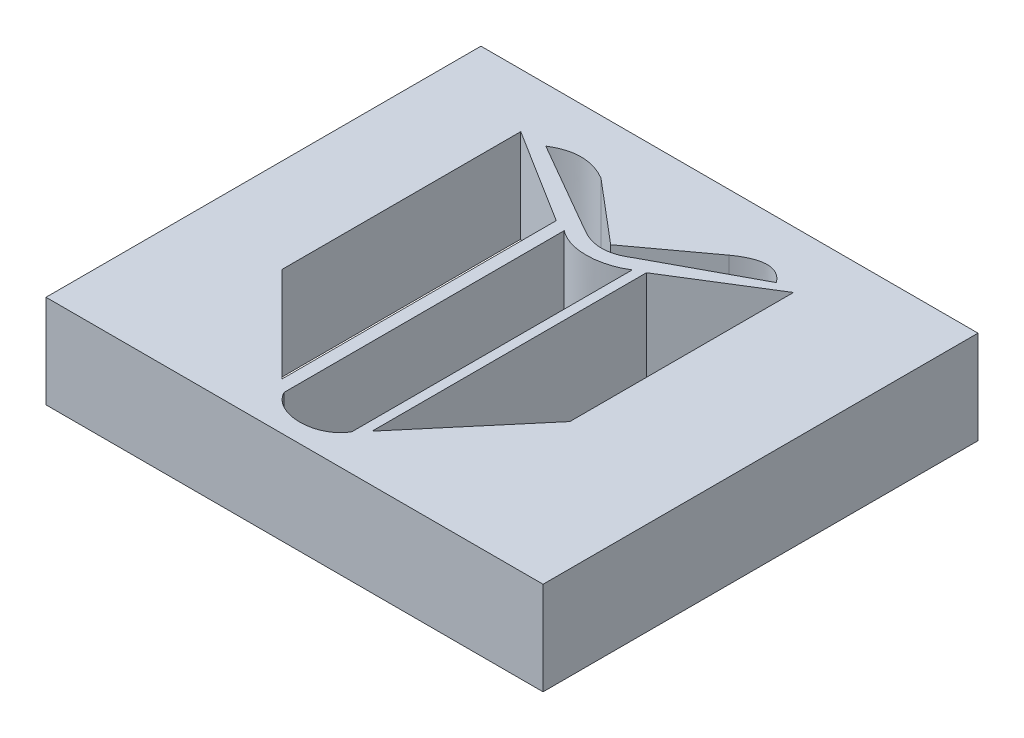
ISO-10303-21;
HEADER;
FILE_DESCRIPTION(('STEP AP214'),'2;1');
FILE_NAME('part.step','',(''),(''),'','','');
FILE_SCHEMA(('AUTOMOTIVE_DESIGN { 1 0 10303 214 1 1 1 1 }'));
ENDSEC;
DATA;
#1=APPLICATION_CONTEXT('core data for automotive mechanical design processes');
#2=APPLICATION_PROTOCOL_DEFINITION('international standard','automotive_design',2000,#1);
#3=PRODUCT_CONTEXT('',#1,'mechanical');
#4=PRODUCT('Part','Part','',(#3));
#5=PRODUCT_RELATED_PRODUCT_CATEGORY('part','',(#4));
#6=PRODUCT_DEFINITION_FORMATION('','',#4);
#7=PRODUCT_DEFINITION_CONTEXT('part definition',#1,'design');
#8=PRODUCT_DEFINITION('design','',#6,#7);
#9=PRODUCT_DEFINITION_SHAPE('','',#8);
#10=(LENGTH_UNIT() NAMED_UNIT(*) SI_UNIT(.MILLI.,.METRE.));
#11=(NAMED_UNIT(*) PLANE_ANGLE_UNIT() SI_UNIT($,.RADIAN.));
#12=(NAMED_UNIT(*) SI_UNIT($,.STERADIAN.) SOLID_ANGLE_UNIT());
#13=UNCERTAINTY_MEASURE_WITH_UNIT(LENGTH_MEASURE(1.E-05),#10,'distance_accuracy_value','');
#14=(GEOMETRIC_REPRESENTATION_CONTEXT(3) GLOBAL_UNCERTAINTY_ASSIGNED_CONTEXT((#13)) GLOBAL_UNIT_ASSIGNED_CONTEXT((#10,
#11,#12)) REPRESENTATION_CONTEXT('',''));
#15=CARTESIAN_POINT('',(0.,0.,0.));
#16=DIRECTION('',(0.,0.,1.));
#17=DIRECTION('',(1.,0.,0.));
#18=AXIS2_PLACEMENT_3D('',#15,#16,#17);
#19=CARTESIAN_POINT('',(-42.8025477707006,3.,-22.3184713375796));
#20=DIRECTION('',(1.,0.,0.));
#21=DIRECTION('',(0.,0.,-1.));
#22=AXIS2_PLACEMENT_3D('',#19,#20,#21);
#23=PLANE('',#22);
#24=DIRECTION('',(0.,0.,1.));
#25=VECTOR('',#24,1.);
#26=CARTESIAN_POINT('',(-42.8025477707006,0.,-22.3184713375796));
#27=LINE('',#26,#25);
#28=CARTESIAN_POINT('',(-42.8025477707006,0.,-22.3184713375796));
#29=VERTEX_POINT('',#28);
#30=CARTESIAN_POINT('',(-42.8025477707006,0.,-8.31847133757962));
#31=VERTEX_POINT('',#30);
#32=EDGE_CURVE('E313',#29,#31,#27,.T.);
#33=ORIENTED_EDGE('',*,*,#32,.T.);
#34=DIRECTION('',(0.,-1.,0.));
#35=VECTOR('',#34,1.);
#36=CARTESIAN_POINT('',(-42.8025477707006,3.,-8.31847133757962));
#37=LINE('',#36,#35);
#38=CARTESIAN_POINT('',(-42.8025477707006,3.,-8.31847133757962));
#39=VERTEX_POINT('',#38);
#40=EDGE_CURVE('E11',#39,#31,#37,.T.);
#41=ORIENTED_EDGE('',*,*,#40,.F.);
#42=DIRECTION('',(0.,0.,1.));
#43=VECTOR('',#42,1.);
#44=CARTESIAN_POINT('',(-42.8025477707006,3.,-22.3184713375796));
#45=LINE('',#44,#43);
#46=CARTESIAN_POINT('',(-42.8025477707006,3.,-22.3184713375796));
#47=VERTEX_POINT('',#46);
#48=EDGE_CURVE('E320',#47,#39,#45,.T.);
#49=ORIENTED_EDGE('',*,*,#48,.F.);
#50=DIRECTION('',(0.,-1.,0.));
#51=VECTOR('',#50,1.);
#52=CARTESIAN_POINT('',(-42.8025477707006,3.,-22.3184713375796));
#53=LINE('',#52,#51);
#54=EDGE_CURVE('E332',#47,#29,#53,.T.);
#55=ORIENTED_EDGE('',*,*,#54,.T.);
#56=EDGE_LOOP('',(#33,#41,#49,#55));
#57=FACE_BOUND('',#56,.T.);
#58=ADVANCED_FACE('F32',(#57),#23,.F.);
#59=CARTESIAN_POINT('',(-42.8025477707006,3.,-8.31847133757962));
#60=DIRECTION('',(0.,0.,-1.));
#61=DIRECTION('',(-1.,0.,0.));
#62=AXIS2_PLACEMENT_3D('',#59,#60,#61);
#63=PLANE('',#62);
#64=DIRECTION('',(1.,0.,0.));
#65=VECTOR('',#64,1.);
#66=CARTESIAN_POINT('',(-42.8025477707006,0.,-8.31847133757962));
#67=LINE('',#66,#65);
#68=CARTESIAN_POINT('',(-26.8025477707006,0.,-8.31847133757962));
#69=VERTEX_POINT('',#68);
#70=EDGE_CURVE('E335',#31,#69,#67,.T.);
#71=ORIENTED_EDGE('',*,*,#70,.T.);
#72=DIRECTION('',(0.,-1.,0.));
#73=VECTOR('',#72,1.);
#74=CARTESIAN_POINT('',(-26.8025477707006,3.,-8.31847133757962));
#75=LINE('',#74,#73);
#76=CARTESIAN_POINT('',(-26.8025477707006,3.,-8.31847133757962));
#77=VERTEX_POINT('',#76);
#78=EDGE_CURVE('E39',#77,#69,#75,.T.);
#79=ORIENTED_EDGE('',*,*,#78,.F.);
#80=DIRECTION('',(1.,0.,0.));
#81=VECTOR('',#80,1.);
#82=CARTESIAN_POINT('',(-42.8025477707006,3.,-8.31847133757962));
#83=LINE('',#82,#81);
#84=EDGE_CURVE('E323',#39,#77,#83,.T.);
#85=ORIENTED_EDGE('',*,*,#84,.F.);
#86=ORIENTED_EDGE('',*,*,#40,.T.);
#87=EDGE_LOOP('',(#71,#79,#85,#86));
#88=FACE_BOUND('',#87,.T.);
#89=ADVANCED_FACE('F351',(#88),#63,.F.);
#90=CARTESIAN_POINT('',(-26.8025477707006,3.,-22.3184713375796));
#91=DIRECTION('',(1.,0.,0.));
#92=DIRECTION('',(0.,0.,-1.));
#93=AXIS2_PLACEMENT_3D('',#90,#91,#92);
#94=PLANE('',#93);
#95=DIRECTION('',(0.,0.,1.));
#96=VECTOR('',#95,1.);
#97=CARTESIAN_POINT('',(-26.8025477707006,0.,-22.3184713375796));
#98=LINE('',#97,#96);
#99=CARTESIAN_POINT('',(-26.8025477707006,0.,-22.3184713375796));
#100=VERTEX_POINT('',#99);
#101=EDGE_CURVE('E338',#100,#69,#98,.T.);
#102=ORIENTED_EDGE('',*,*,#101,.F.);
#103=DIRECTION('',(0.,-1.,0.));
#104=VECTOR('',#103,1.);
#105=CARTESIAN_POINT('',(-26.8025477707006,3.,-22.3184713375796));
#106=LINE('',#105,#104);
#107=CARTESIAN_POINT('',(-26.8025477707006,3.,-22.3184713375796));
#108=VERTEX_POINT('',#107);
#109=EDGE_CURVE('E344',#108,#100,#106,.T.);
#110=ORIENTED_EDGE('',*,*,#109,.F.);
#111=DIRECTION('',(0.,0.,1.));
#112=VECTOR('',#111,1.);
#113=CARTESIAN_POINT('',(-26.8025477707006,3.,-22.3184713375796));
#114=LINE('',#113,#112);
#115=EDGE_CURVE('E326',#108,#77,#114,.T.);
#116=ORIENTED_EDGE('',*,*,#115,.T.);
#117=ORIENTED_EDGE('',*,*,#78,.T.);
#118=EDGE_LOOP('',(#102,#110,#116,#117));
#119=FACE_BOUND('',#118,.T.);
#120=ADVANCED_FACE('F348',(#119),#94,.T.);
#121=CARTESIAN_POINT('',(-42.8025477707006,3.,-22.3184713375796));
#122=DIRECTION('',(0.,0.,-1.));
#123=DIRECTION('',(-1.,0.,0.));
#124=AXIS2_PLACEMENT_3D('',#121,#122,#123);
#125=PLANE('',#124);
#126=DIRECTION('',(1.,0.,0.));
#127=VECTOR('',#126,1.);
#128=CARTESIAN_POINT('',(-42.8025477707006,0.,-22.3184713375796));
#129=LINE('',#128,#127);
#130=EDGE_CURVE('E324',#29,#100,#129,.T.);
#131=ORIENTED_EDGE('',*,*,#130,.F.);
#132=ORIENTED_EDGE('',*,*,#54,.F.);
#133=DIRECTION('',(1.,0.,0.));
#134=VECTOR('',#133,1.);
#135=CARTESIAN_POINT('',(-42.8025477707006,3.,-22.3184713375796));
#136=LINE('',#135,#134);
#137=EDGE_CURVE('E329',#47,#108,#136,.T.);
#138=ORIENTED_EDGE('',*,*,#137,.T.);
#139=ORIENTED_EDGE('',*,*,#109,.T.);
#140=EDGE_LOOP('',(#131,#132,#138,#139));
#141=FACE_BOUND('',#140,.T.);
#142=ADVANCED_FACE('F357',(#141),#125,.T.);
#143=CARTESIAN_POINT('',(0.,3.,0.));
#144=DIRECTION('',(0.,1.,0.));
#145=DIRECTION('',(0.,0.,1.));
#146=AXIS2_PLACEMENT_3D('',#143,#144,#145);
#147=PLANE('',#146);
#148=DIRECTION('',(-0.848959317139433,0.,0.528458208226675));
#149=VECTOR('',#148,1.);
#150=CARTESIAN_POINT('',(-30.9058594232507,3.,-20.4817876301132));
#151=LINE('',#150,#149);
#152=CARTESIAN_POINT('',(-30.9058594232507,3.,-20.4817876301132));
#153=VERTEX_POINT('',#152);
#154=CARTESIAN_POINT('',(-33.8220538371953,3.,-18.6665217584499));
#155=VERTEX_POINT('',#154);
#156=EDGE_CURVE('E46',#153,#155,#151,.T.);
#157=ORIENTED_EDGE('',*,*,#156,.F.);
#158=DIRECTION('',(0.,0.,-1.));
#159=VECTOR('',#158,1.);
#160=CARTESIAN_POINT('',(-30.9058594232507,3.,-13.2839687117296));
#161=LINE('',#160,#159);
#162=CARTESIAN_POINT('',(-30.9058594232507,3.,-13.2839687117296));
#163=VERTEX_POINT('',#162);
#164=EDGE_CURVE('E428',#163,#153,#161,.T.);
#165=ORIENTED_EDGE('',*,*,#164,.F.);
#166=DIRECTION('',(0.645256381205289,0.,-0.763966100369548));
#167=VECTOR('',#166,1.);
#168=CARTESIAN_POINT('',(-33.8220538371952,3.,-9.83127341225932));
#169=LINE('',#168,#167);
#170=CARTESIAN_POINT('',(-33.8220538371952,3.,-9.83127341225932));
#171=VERTEX_POINT('',#170);
#172=EDGE_CURVE('E432',#171,#163,#169,.T.);
#173=ORIENTED_EDGE('',*,*,#172,.F.);
#174=DIRECTION('',(0.,0.,1.));
#175=VECTOR('',#174,1.);
#176=CARTESIAN_POINT('',(-33.8220538371953,3.,-18.6665217584499));
#177=LINE('',#176,#175);
#178=EDGE_CURVE('E435',#155,#171,#177,.T.);
#179=ORIENTED_EDGE('',*,*,#178,.F.);
#180=EDGE_LOOP('',(#157,#165,#173,#179));
#181=FACE_BOUND('',#180,.T.);
#182=DIRECTION('',(-0.847812908363935,0.,-0.530295457656848));
#183=VECTOR('',#182,1.);
#184=CARTESIAN_POINT('',(-39.7792265366919,3.,-20.5759226962066));
#185=LINE('',#184,#183);
#186=CARTESIAN_POINT('',(-36.7265608219502,3.,-18.6665217584499));
#187=VERTEX_POINT('',#186);
#188=CARTESIAN_POINT('',(-39.7792265366919,3.,-20.5759226962066));
#189=VERTEX_POINT('',#188);
#190=EDGE_CURVE('E54',#187,#189,#185,.T.);
#191=ORIENTED_EDGE('',*,*,#190,.F.);
#192=DIRECTION('',(0.,0.,-1.));
#193=VECTOR('',#192,1.);
#194=CARTESIAN_POINT('',(-36.7265608219502,3.,-18.6665217584499));
#195=LINE('',#194,#193);
#196=CARTESIAN_POINT('',(-36.7265608219502,3.,-9.83127341225926));
#197=VERTEX_POINT('',#196);
#198=EDGE_CURVE('E398',#197,#187,#195,.T.);
#199=ORIENTED_EDGE('',*,*,#198,.F.);
#200=DIRECTION('',(0.707106781186547,0.,0.707106781186548));
#201=VECTOR('',#200,1.);
#202=CARTESIAN_POINT('',(-36.7265608219502,3.,-9.83127341225926));
#203=LINE('',#202,#201);
#204=CARTESIAN_POINT('',(-39.7792265366919,3.,-12.8839391270009));
#205=VERTEX_POINT('',#204);
#206=EDGE_CURVE('E402',#205,#197,#203,.T.);
#207=ORIENTED_EDGE('',*,*,#206,.F.);
#208=DIRECTION('',(0.,0.,1.));
#209=VECTOR('',#208,1.);
#210=CARTESIAN_POINT('',(-39.7792265366919,3.,-12.8839391270009));
#211=LINE('',#210,#209);
#212=EDGE_CURVE('E405',#189,#205,#211,.T.);
#213=ORIENTED_EDGE('',*,*,#212,.F.);
#214=EDGE_LOOP('',(#191,#199,#207,#213));
#215=FACE_BOUND('',#214,.T.);
#216=CARTESIAN_POINT('',(-37.1972361524169,3.,-20.5759226962066));
#217=CARTESIAN_POINT('',(-38.1191893127759,3.,-21.1146198248438));
#218=CARTESIAN_POINT('',(-38.972354541606,3.,-20.5759226962066));
#219=B_SPLINE_CURVE_WITH_KNOTS('',2,(#216,#217,#218),.UNSPECIFIED.,.F.,.F.,(3,3),(0.,1.),.UNSPECIFIED.);
#220=CARTESIAN_POINT('',(-37.1972361524169,3.,-20.5759226962066));
#221=VERTEX_POINT('',#220);
#222=CARTESIAN_POINT('',(-38.972354541606,3.,-20.5759226962066));
#223=VERTEX_POINT('',#222);
#224=EDGE_CURVE('E193',#221,#223,#219,.T.);
#225=ORIENTED_EDGE('',*,*,#224,.F.);
#226=DIRECTION('',(-0.763966100369548,0.,-0.645256381205289));
#227=VECTOR('',#226,1.);
#228=CARTESIAN_POINT('',(-37.1972361524169,3.,-20.5759226962066));
#229=LINE('',#228,#227);
#230=CARTESIAN_POINT('',(-35.1792345223851,3.,-18.8714904858888));
#231=VERTEX_POINT('',#230);
#232=EDGE_CURVE('E212',#231,#221,#229,.T.);
#233=ORIENTED_EDGE('',*,*,#232,.F.);
#234=DIRECTION('',(-0.805802815888019,0.,0.592183942628419));
#235=VECTOR('',#234,1.);
#236=CARTESIAN_POINT('',(-35.1033211486133,3.,-18.9272791727635));
#237=LINE('',#236,#235);
#238=CARTESIAN_POINT('',(-32.9880539113856,3.,-20.4817876301132));
#239=VERTEX_POINT('',#238);
#240=EDGE_CURVE('E215',#239,#231,#237,.T.);
#241=ORIENTED_EDGE('',*,*,#240,.F.);
#242=CARTESIAN_POINT('',(-31.4549971207224,3.,-20.4817876301132));
#243=CARTESIAN_POINT('',(-31.9963912960956,3.,-21.1943880019316));
#244=CARTESIAN_POINT('',(-32.9880539113856,3.,-20.4817876301132));
#245=B_SPLINE_CURVE_WITH_KNOTS('',2,(#242,#243,#244),.UNSPECIFIED.,.F.,.F.,(3,3),(0.,1.),.UNSPECIFIED.);
#246=CARTESIAN_POINT('',(-31.4549971207224,3.,-20.4817876301132));
#247=VERTEX_POINT('',#246);
#248=EDGE_CURVE('E461',#247,#239,#245,.T.);
#249=ORIENTED_EDGE('',*,*,#248,.F.);
#250=DIRECTION('',(0.881020069757476,0.,-0.473078890550542));
#251=VECTOR('',#250,1.);
#252=CARTESIAN_POINT('',(-31.4549971207224,3.,-20.4817876301132));
#253=LINE('',#252,#251);
#254=CARTESIAN_POINT('',(-34.4538713691249,3.,-18.8714904858887));
#255=VERTEX_POINT('',#254);
#256=EDGE_CURVE('E466',#255,#247,#253,.T.);
#257=ORIENTED_EDGE('',*,*,#256,.F.);
#258=CARTESIAN_POINT('',(-36.0138238929577,3.,-18.8714904858887));
#259=CARTESIAN_POINT('',(-35.2239354592146,3.,-18.3788675124295));
#260=CARTESIAN_POINT('',(-34.4538713691249,3.,-18.8714904858887));
#261=B_SPLINE_CURVE_WITH_KNOTS('',2,(#258,#259,#260),.UNSPECIFIED.,.F.,.F.,(3,3),(0.,1.),.UNSPECIFIED.);
#262=CARTESIAN_POINT('',(-36.0138238929577,3.,-18.8714904858887));
#263=VERTEX_POINT('',#262);
#264=EDGE_CURVE('E472',#263,#255,#261,.T.);
#265=ORIENTED_EDGE('',*,*,#264,.F.);
#266=DIRECTION('',(0.866491251164208,0.,0.499192259210702));
#267=VECTOR('',#266,1.);
#268=CARTESIAN_POINT('',(-38.972354541606,3.,-20.5759226962066));
#269=LINE('',#268,#267);
#270=EDGE_CURVE('E477',#223,#263,#269,.T.);
#271=ORIENTED_EDGE('',*,*,#270,.F.);
#272=EDGE_LOOP('',(#225,#233,#241,#249,#257,#265,#271));
#273=FACE_BOUND('',#272,.T.);
#274=CARTESIAN_POINT('',(-34.1300466465121,3.,-18.5161217589404));
#275=CARTESIAN_POINT('',(-34.7644663392593,3.,-18.1148016720299));
#276=CARTESIAN_POINT('',(-35.7095935701937,3.,-18.038988867181));
#277=CARTESIAN_POINT('',(-36.3189117549375,3.,-18.5161217589404));
#278=B_SPLINE_CURVE_WITH_KNOTS('',3,(#274,#275,#276,#277),.UNSPECIFIED.,.F.,.F.,(4,4),(0.,1.),.UNSPECIFIED.);
#279=CARTESIAN_POINT('',(-34.1300466465121,3.,-18.5161217589404));
#280=VERTEX_POINT('',#279);
#281=CARTESIAN_POINT('',(-36.3189117549375,3.,-18.5161217589404));
#282=VERTEX_POINT('',#281);
#283=EDGE_CURVE('E288',#280,#282,#278,.T.);
#284=ORIENTED_EDGE('',*,*,#283,.F.);
#285=DIRECTION('',(0.,0.,-1.));
#286=VECTOR('',#285,1.);
#287=CARTESIAN_POINT('',(-34.1300466465121,3.,-18.5161217589404));
#288=LINE('',#287,#286);
#289=CARTESIAN_POINT('',(-34.1300466465121,3.,-9.49576682167129));
#290=VERTEX_POINT('',#289);
#291=EDGE_CURVE('E304',#290,#280,#288,.T.);
#292=ORIENTED_EDGE('',*,*,#291,.F.);
#293=CARTESIAN_POINT('',(-36.3189117549375,3.,-9.49576682167129));
#294=CARTESIAN_POINT('',(-35.9138716025533,3.,-8.72089363356265));
#295=CARTESIAN_POINT('',(-34.5432818209966,3.,-8.74101558401881));
#296=CARTESIAN_POINT('',(-34.1300466465121,3.,-9.49576682167129));
#297=B_SPLINE_CURVE_WITH_KNOTS('',3,(#293,#294,#295,#296),.UNSPECIFIED.,.F.,.F.,(4,4),(0.,1.),.UNSPECIFIED.);
#298=CARTESIAN_POINT('',(-36.3189117549375,3.,-9.49576682167129));
#299=VERTEX_POINT('',#298);
#300=EDGE_CURVE('E299',#299,#290,#297,.T.);
#301=ORIENTED_EDGE('',*,*,#300,.F.);
#302=DIRECTION('',(0.,0.,1.));
#303=VECTOR('',#302,1.);
#304=CARTESIAN_POINT('',(-36.3189117549375,3.,-18.5161217589404));
#305=LINE('',#304,#303);
#306=EDGE_CURVE('E292',#282,#299,#305,.T.);
#307=ORIENTED_EDGE('',*,*,#306,.F.);
#308=EDGE_LOOP('',(#284,#292,#301,#307));
#309=FACE_BOUND('',#308,.T.);
#310=ORIENTED_EDGE('',*,*,#48,.T.);
#311=ORIENTED_EDGE('',*,*,#84,.T.);
#312=ORIENTED_EDGE('',*,*,#115,.F.);
#313=ORIENTED_EDGE('',*,*,#137,.F.);
#314=EDGE_LOOP('',(#310,#311,#312,#313));
#315=FACE_BOUND('',#314,.T.);
#316=ADVANCED_FACE('F361',(#181,#215,#273,#309,#315),#147,.T.);
#317=CARTESIAN_POINT('',(0.,0.,0.));
#318=DIRECTION('',(0.,1.,0.));
#319=DIRECTION('',(0.,0.,1.));
#320=AXIS2_PLACEMENT_3D('',#317,#318,#319);
#321=PLANE('',#320);
#322=DIRECTION('',(0.,0.,-1.));
#323=VECTOR('',#322,1.);
#324=CARTESIAN_POINT('',(-30.9058594232507,0.,-13.2839687117296));
#325=LINE('',#324,#323);
#326=CARTESIAN_POINT('',(-30.9058594232507,0.,-13.2839687117296));
#327=VERTEX_POINT('',#326);
#328=CARTESIAN_POINT('',(-30.9058594232507,0.,-20.4817876301132));
#329=VERTEX_POINT('',#328);
#330=EDGE_CURVE('E423',#327,#329,#325,.T.);
#331=ORIENTED_EDGE('',*,*,#330,.T.);
#332=DIRECTION('',(-0.848959317139433,0.,0.528458208226675));
#333=VECTOR('',#332,1.);
#334=CARTESIAN_POINT('',(-30.9058594232507,0.,-20.4817876301132));
#335=LINE('',#334,#333);
#336=CARTESIAN_POINT('',(-33.8220538371953,0.,-18.6665217584499));
#337=VERTEX_POINT('',#336);
#338=EDGE_CURVE('E431',#329,#337,#335,.T.);
#339=ORIENTED_EDGE('',*,*,#338,.T.);
#340=DIRECTION('',(0.,0.,1.));
#341=VECTOR('',#340,1.);
#342=CARTESIAN_POINT('',(-33.8220538371953,0.,-18.6665217584499));
#343=LINE('',#342,#341);
#344=CARTESIAN_POINT('',(-33.8220538371952,0.,-9.83127341225932));
#345=VERTEX_POINT('',#344);
#346=EDGE_CURVE('E444',#337,#345,#343,.T.);
#347=ORIENTED_EDGE('',*,*,#346,.T.);
#348=DIRECTION('',(0.645256381205289,0.,-0.763966100369548));
#349=VECTOR('',#348,1.);
#350=CARTESIAN_POINT('',(-33.8220538371952,0.,-9.83127341225932));
#351=LINE('',#350,#349);
#352=EDGE_CURVE('E441',#345,#327,#351,.T.);
#353=ORIENTED_EDGE('',*,*,#352,.T.);
#354=EDGE_LOOP('',(#331,#339,#347,#353));
#355=FACE_BOUND('',#354,.T.);
#356=DIRECTION('',(0.,0.,-1.));
#357=VECTOR('',#356,1.);
#358=CARTESIAN_POINT('',(-36.7265608219502,0.,-18.6665217584499));
#359=LINE('',#358,#357);
#360=CARTESIAN_POINT('',(-36.7265608219502,0.,-9.83127341225926));
#361=VERTEX_POINT('',#360);
#362=CARTESIAN_POINT('',(-36.7265608219502,0.,-18.6665217584499));
#363=VERTEX_POINT('',#362);
#364=EDGE_CURVE('E392',#361,#363,#359,.T.);
#365=ORIENTED_EDGE('',*,*,#364,.T.);
#366=DIRECTION('',(-0.847812908363935,0.,-0.530295457656848));
#367=VECTOR('',#366,1.);
#368=CARTESIAN_POINT('',(-39.7792265366919,0.,-20.5759226962066));
#369=LINE('',#368,#367);
#370=CARTESIAN_POINT('',(-39.7792265366919,0.,-20.5759226962066));
#371=VERTEX_POINT('',#370);
#372=EDGE_CURVE('E401',#363,#371,#369,.T.);
#373=ORIENTED_EDGE('',*,*,#372,.T.);
#374=DIRECTION('',(0.,0.,1.));
#375=VECTOR('',#374,1.);
#376=CARTESIAN_POINT('',(-39.7792265366919,0.,-12.8839391270009));
#377=LINE('',#376,#375);
#378=CARTESIAN_POINT('',(-39.7792265366919,0.,-12.8839391270009));
#379=VERTEX_POINT('',#378);
#380=EDGE_CURVE('E415',#371,#379,#377,.T.);
#381=ORIENTED_EDGE('',*,*,#380,.T.);
#382=DIRECTION('',(0.707106781186547,0.,0.707106781186548));
#383=VECTOR('',#382,1.);
#384=CARTESIAN_POINT('',(-36.7265608219502,0.,-9.83127341225926));
#385=LINE('',#384,#383);
#386=EDGE_CURVE('E412',#379,#361,#385,.T.);
#387=ORIENTED_EDGE('',*,*,#386,.T.);
#388=EDGE_LOOP('',(#365,#373,#381,#387));
#389=FACE_BOUND('',#388,.T.);
#390=DIRECTION('',(-0.763966100369548,0.,-0.645256381205289));
#391=VECTOR('',#390,1.);
#392=CARTESIAN_POINT('',(-37.1972361524169,0.,-20.5759226962066));
#393=LINE('',#392,#391);
#394=CARTESIAN_POINT('',(-35.1792345223851,0.,-18.8714904858888));
#395=VERTEX_POINT('',#394);
#396=CARTESIAN_POINT('',(-37.1972361524169,0.,-20.5759226962066));
#397=VERTEX_POINT('',#396);
#398=EDGE_CURVE('E198',#395,#397,#393,.T.);
#399=ORIENTED_EDGE('',*,*,#398,.T.);
#400=CARTESIAN_POINT('',(-37.1972361524169,0.,-20.5759226962066));
#401=CARTESIAN_POINT('',(-38.1191893127759,0.,-21.1146198248438));
#402=CARTESIAN_POINT('',(-38.972354541606,0.,-20.5759226962066));
#403=B_SPLINE_CURVE_WITH_KNOTS('',2,(#400,#401,#402),.UNSPECIFIED.,.F.,.F.,(3,3),(0.,1.),.UNSPECIFIED.);
#404=CARTESIAN_POINT('',(-38.972354541606,0.,-20.5759226962066));
#405=VERTEX_POINT('',#404);
#406=EDGE_CURVE('E190',#397,#405,#403,.T.);
#407=ORIENTED_EDGE('',*,*,#406,.T.);
#408=DIRECTION('',(0.866491251164208,0.,0.499192259210702));
#409=VECTOR('',#408,1.);
#410=CARTESIAN_POINT('',(-38.972354541606,0.,-20.5759226962066));
#411=LINE('',#410,#409);
#412=CARTESIAN_POINT('',(-36.0138238929577,0.,-18.8714904858887));
#413=VERTEX_POINT('',#412);
#414=EDGE_CURVE('E202',#405,#413,#411,.T.);
#415=ORIENTED_EDGE('',*,*,#414,.T.);
#416=CARTESIAN_POINT('',(-36.0138238929577,0.,-18.8714904858887));
#417=CARTESIAN_POINT('',(-35.2239354592146,0.,-18.3788675124295));
#418=CARTESIAN_POINT('',(-34.4538713691249,0.,-18.8714904858887));
#419=B_SPLINE_CURVE_WITH_KNOTS('',2,(#416,#417,#418),.UNSPECIFIED.,.F.,.F.,(3,3),(0.,1.),.UNSPECIFIED.);
#420=CARTESIAN_POINT('',(-34.4538713691249,0.,-18.8714904858887));
#421=VERTEX_POINT('',#420);
#422=EDGE_CURVE('E206',#413,#421,#419,.T.);
#423=ORIENTED_EDGE('',*,*,#422,.T.);
#424=DIRECTION('',(0.881020069757476,0.,-0.473078890550542));
#425=VECTOR('',#424,1.);
#426=CARTESIAN_POINT('',(-31.4549971207224,0.,-20.4817876301132));
#427=LINE('',#426,#425);
#428=CARTESIAN_POINT('',(-31.4549971207224,0.,-20.4817876301132));
#429=VERTEX_POINT('',#428);
#430=EDGE_CURVE('E497',#421,#429,#427,.T.);
#431=ORIENTED_EDGE('',*,*,#430,.T.);
#432=CARTESIAN_POINT('',(-31.4549971207224,0.,-20.4817876301132));
#433=CARTESIAN_POINT('',(-31.9963912960956,0.,-21.1943880019316));
#434=CARTESIAN_POINT('',(-32.9880539113856,0.,-20.4817876301132));
#435=B_SPLINE_CURVE_WITH_KNOTS('',2,(#432,#433,#434),.UNSPECIFIED.,.F.,.F.,(3,3),(0.,1.),.UNSPECIFIED.);
#436=CARTESIAN_POINT('',(-32.9880539113856,0.,-20.4817876301132));
#437=VERTEX_POINT('',#436);
#438=EDGE_CURVE('E491',#429,#437,#435,.T.);
#439=ORIENTED_EDGE('',*,*,#438,.T.);
#440=DIRECTION('',(-0.805802815888049,0.,0.592183942628378));
#441=VECTOR('',#440,1.);
#442=CARTESIAN_POINT('',(-35.1033211486133,0.,-18.9272791727635));
#443=LINE('',#442,#441);
#444=EDGE_CURVE('E489',#437,#395,#443,.T.);
#445=ORIENTED_EDGE('',*,*,#444,.T.);
#446=EDGE_LOOP('',(#399,#407,#415,#423,#431,#439,#445));
#447=FACE_BOUND('',#446,.T.);
#448=DIRECTION('',(0.,0.,-1.));
#449=VECTOR('',#448,1.);
#450=CARTESIAN_POINT('',(-34.1300466465121,0.,-18.5161217589404));
#451=LINE('',#450,#449);
#452=CARTESIAN_POINT('',(-34.1300466465121,0.,-9.49576682167129));
#453=VERTEX_POINT('',#452);
#454=CARTESIAN_POINT('',(-34.1300466465121,0.,-18.5161217589404));
#455=VERTEX_POINT('',#454);
#456=EDGE_CURVE('E279',#453,#455,#451,.T.);
#457=ORIENTED_EDGE('',*,*,#456,.T.);
#458=CARTESIAN_POINT('',(-34.1300466465121,0.,-18.5161217589404));
#459=CARTESIAN_POINT('',(-34.7644663392593,0.,-18.1148016720299));
#460=CARTESIAN_POINT('',(-35.7095935701937,0.,-18.038988867181));
#461=CARTESIAN_POINT('',(-36.3189117549375,0.,-18.5161217589404));
#462=B_SPLINE_CURVE_WITH_KNOTS('',3,(#458,#459,#460,#461),.UNSPECIFIED.,.F.,.F.,(4,4),(0.,1.),.UNSPECIFIED.);
#463=CARTESIAN_POINT('',(-36.3189117549375,0.,-18.5161217589404));
#464=VERTEX_POINT('',#463);
#465=EDGE_CURVE('E310',#455,#464,#462,.T.);
#466=ORIENTED_EDGE('',*,*,#465,.T.);
#467=DIRECTION('',(0.,0.,1.));
#468=VECTOR('',#467,1.);
#469=CARTESIAN_POINT('',(-36.3189117549375,0.,-18.5161217589404));
#470=LINE('',#469,#468);
#471=CARTESIAN_POINT('',(-36.3189117549375,0.,-9.49576682167129));
#472=VERTEX_POINT('',#471);
#473=EDGE_CURVE('E280',#464,#472,#470,.T.);
#474=ORIENTED_EDGE('',*,*,#473,.T.);
#475=CARTESIAN_POINT('',(-36.3189117549375,0.,-9.49576682167129));
#476=CARTESIAN_POINT('',(-35.9138716025533,0.,-8.72089363356265));
#477=CARTESIAN_POINT('',(-34.5432818209966,0.,-8.74101558401881));
#478=CARTESIAN_POINT('',(-34.1300466465121,0.,-9.49576682167129));
#479=B_SPLINE_CURVE_WITH_KNOTS('',3,(#475,#476,#477,#478),.UNSPECIFIED.,.F.,.F.,(4,4),(0.,1.),.UNSPECIFIED.);
#480=EDGE_CURVE('E272',#472,#453,#479,.T.);
#481=ORIENTED_EDGE('',*,*,#480,.T.);
#482=EDGE_LOOP('',(#457,#466,#474,#481));
#483=FACE_BOUND('',#482,.T.);
#484=ORIENTED_EDGE('',*,*,#32,.F.);
#485=ORIENTED_EDGE('',*,*,#130,.T.);
#486=ORIENTED_EDGE('',*,*,#101,.T.);
#487=ORIENTED_EDGE('',*,*,#70,.F.);
#488=EDGE_LOOP('',(#484,#485,#486,#487));
#489=FACE_BOUND('',#488,.T.);
#490=ADVANCED_FACE('F208',(#355,#389,#447,#483,#489),#321,.F.);
#491=DIRECTION('',(0.,1.,0.));
#492=VECTOR('',#491,1.);
#493=SURFACE_OF_LINEAR_EXTRUSION('',#462,#492);
#494=ORIENTED_EDGE('',*,*,#283,.T.);
#495=DIRECTION('',(0.,1.,0.));
#496=VECTOR('',#495,1.);
#497=CARTESIAN_POINT('',(-36.3189117549375,0.,-18.5161217589404));
#498=LINE('',#497,#496);
#499=EDGE_CURVE('E287',#464,#282,#498,.T.);
#500=ORIENTED_EDGE('',*,*,#499,.F.);
#501=ORIENTED_EDGE('',*,*,#465,.F.);
#502=DIRECTION('',(0.,1.,0.));
#503=VECTOR('',#502,1.);
#504=CARTESIAN_POINT('',(-34.1300466465121,0.,-18.5161217589404));
#505=LINE('',#504,#503);
#506=EDGE_CURVE('E311',#455,#280,#505,.T.);
#507=ORIENTED_EDGE('',*,*,#506,.T.);
#508=EDGE_LOOP('',(#494,#500,#501,#507));
#509=FACE_BOUND('',#508,.T.);
#510=ADVANCED_FACE('F265',(#509),#493,.F.);
#511=CARTESIAN_POINT('',(-34.1300466465121,0.,-18.5161217589404));
#512=DIRECTION('',(1.,0.,0.));
#513=DIRECTION('',(0.,0.,-1.));
#514=AXIS2_PLACEMENT_3D('',#511,#512,#513);
#515=PLANE('',#514);
#516=ORIENTED_EDGE('',*,*,#291,.T.);
#517=ORIENTED_EDGE('',*,*,#506,.F.);
#518=ORIENTED_EDGE('',*,*,#456,.F.);
#519=DIRECTION('',(0.,1.,0.));
#520=VECTOR('',#519,1.);
#521=CARTESIAN_POINT('',(-34.1300466465121,0.,-9.49576682167129));
#522=LINE('',#521,#520);
#523=EDGE_CURVE('E314',#453,#290,#522,.T.);
#524=ORIENTED_EDGE('',*,*,#523,.T.);
#525=EDGE_LOOP('',(#516,#517,#518,#524));
#526=FACE_BOUND('',#525,.T.);
#527=ADVANCED_FACE('F261',(#526),#515,.F.);
#528=DIRECTION('',(0.,1.,0.));
#529=VECTOR('',#528,1.);
#530=SURFACE_OF_LINEAR_EXTRUSION('',#479,#529);
#531=ORIENTED_EDGE('',*,*,#300,.T.);
#532=ORIENTED_EDGE('',*,*,#523,.F.);
#533=ORIENTED_EDGE('',*,*,#480,.F.);
#534=DIRECTION('',(0.,1.,0.));
#535=VECTOR('',#534,1.);
#536=CARTESIAN_POINT('',(-36.3189117549375,0.,-9.49576682167129));
#537=LINE('',#536,#535);
#538=EDGE_CURVE('E316',#472,#299,#537,.T.);
#539=ORIENTED_EDGE('',*,*,#538,.T.);
#540=EDGE_LOOP('',(#531,#532,#533,#539));
#541=FACE_BOUND('',#540,.T.);
#542=ADVANCED_FACE('F264',(#541),#530,.F.);
#543=CARTESIAN_POINT('',(-36.3189117549375,0.,-18.5161217589404));
#544=DIRECTION('',(-1.,0.,0.));
#545=DIRECTION('',(0.,0.,1.));
#546=AXIS2_PLACEMENT_3D('',#543,#544,#545);
#547=PLANE('',#546);
#548=ORIENTED_EDGE('',*,*,#306,.T.);
#549=ORIENTED_EDGE('',*,*,#538,.F.);
#550=ORIENTED_EDGE('',*,*,#473,.F.);
#551=ORIENTED_EDGE('',*,*,#499,.T.);
#552=EDGE_LOOP('',(#548,#549,#550,#551));
#553=FACE_BOUND('',#552,.T.);
#554=ADVANCED_FACE('F229',(#553),#547,.F.);
#555=DIRECTION('',(0.,1.,0.));
#556=VECTOR('',#555,1.);
#557=SURFACE_OF_LINEAR_EXTRUSION('',#403,#556);
#558=ORIENTED_EDGE('',*,*,#224,.T.);
#559=DIRECTION('',(0.,1.,0.));
#560=VECTOR('',#559,1.);
#561=CARTESIAN_POINT('',(-38.972354541606,0.,-20.5759226962066));
#562=LINE('',#561,#560);
#563=EDGE_CURVE('E186',#405,#223,#562,.T.);
#564=ORIENTED_EDGE('',*,*,#563,.F.);
#565=ORIENTED_EDGE('',*,*,#406,.F.);
#566=DIRECTION('',(0.,1.,0.));
#567=VECTOR('',#566,1.);
#568=CARTESIAN_POINT('',(-37.1972361524169,0.,-20.5759226962066));
#569=LINE('',#568,#567);
#570=EDGE_CURVE('E409',#397,#221,#569,.T.);
#571=ORIENTED_EDGE('',*,*,#570,.T.);
#572=EDGE_LOOP('',(#558,#564,#565,#571));
#573=FACE_BOUND('',#572,.T.);
#574=ADVANCED_FACE('F188',(#573),#557,.F.);
#575=CARTESIAN_POINT('',(-37.1972361524169,0.,-20.5759226962066));
#576=DIRECTION('',(0.645256381205289,0.,-0.763966100369548));
#577=DIRECTION('',(-0.763966100369548,0.,-0.645256381205289));
#578=AXIS2_PLACEMENT_3D('',#575,#576,#577);
#579=PLANE('',#578);
#580=ORIENTED_EDGE('',*,*,#232,.T.);
#581=ORIENTED_EDGE('',*,*,#570,.F.);
#582=ORIENTED_EDGE('',*,*,#398,.F.);
#583=DIRECTION('',(0.,1.,0.));
#584=VECTOR('',#583,1.);
#585=CARTESIAN_POINT('',(-35.1792345223851,0.,-18.8714904858888));
#586=LINE('',#585,#584);
#587=EDGE_CURVE('E456',#395,#231,#586,.T.);
#588=ORIENTED_EDGE('',*,*,#587,.T.);
#589=EDGE_LOOP('',(#580,#581,#582,#588));
#590=FACE_BOUND('',#589,.T.);
#591=ADVANCED_FACE('F228',(#590),#579,.F.);
#592=CARTESIAN_POINT('',(-35.1033211486133,0.,-18.9272791727635));
#593=DIRECTION('',(-0.592183942628419,0.,-0.805802815888019));
#594=DIRECTION('',(-0.80580281588802,0.,0.592183942628419));
#595=AXIS2_PLACEMENT_3D('',#592,#593,#594);
#596=PLANE('',#595);
#597=ORIENTED_EDGE('',*,*,#240,.T.);
#598=ORIENTED_EDGE('',*,*,#587,.F.);
#599=ORIENTED_EDGE('',*,*,#444,.F.);
#600=DIRECTION('',(0.,1.,0.));
#601=VECTOR('',#600,1.);
#602=CARTESIAN_POINT('',(-32.9880539113856,0.,-20.4817876301132));
#603=LINE('',#602,#601);
#604=EDGE_CURVE('E454',#437,#239,#603,.T.);
#605=ORIENTED_EDGE('',*,*,#604,.T.);
#606=EDGE_LOOP('',(#597,#598,#599,#605));
#607=FACE_BOUND('',#606,.T.);
#608=ADVANCED_FACE('F507',(#607),#596,.F.);
#609=DIRECTION('',(0.,1.,0.));
#610=VECTOR('',#609,1.);
#611=SURFACE_OF_LINEAR_EXTRUSION('',#435,#610);
#612=ORIENTED_EDGE('',*,*,#248,.T.);
#613=ORIENTED_EDGE('',*,*,#604,.F.);
#614=ORIENTED_EDGE('',*,*,#438,.F.);
#615=DIRECTION('',(0.,1.,0.));
#616=VECTOR('',#615,1.);
#617=CARTESIAN_POINT('',(-31.4549971207224,0.,-20.4817876301132));
#618=LINE('',#617,#616);
#619=EDGE_CURVE('E452',#429,#247,#618,.T.);
#620=ORIENTED_EDGE('',*,*,#619,.T.);
#621=EDGE_LOOP('',(#612,#613,#614,#620));
#622=FACE_BOUND('',#621,.T.);
#623=ADVANCED_FACE('F502',(#622),#611,.F.);
#624=CARTESIAN_POINT('',(-31.4549971207224,0.,-20.4817876301132));
#625=DIRECTION('',(0.473078890550542,0.,0.881020069757476));
#626=DIRECTION('',(0.881020069757476,0.,-0.473078890550542));
#627=AXIS2_PLACEMENT_3D('',#624,#625,#626);
#628=PLANE('',#627);
#629=ORIENTED_EDGE('',*,*,#256,.T.);
#630=ORIENTED_EDGE('',*,*,#619,.F.);
#631=ORIENTED_EDGE('',*,*,#430,.F.);
#632=DIRECTION('',(0.,1.,0.));
#633=VECTOR('',#632,1.);
#634=CARTESIAN_POINT('',(-34.4538713691249,0.,-18.8714904858887));
#635=LINE('',#634,#633);
#636=EDGE_CURVE('E450',#421,#255,#635,.T.);
#637=ORIENTED_EDGE('',*,*,#636,.T.);
#638=EDGE_LOOP('',(#629,#630,#631,#637));
#639=FACE_BOUND('',#638,.T.);
#640=ADVANCED_FACE('F506',(#639),#628,.F.);
#641=DIRECTION('',(0.,1.,0.));
#642=VECTOR('',#641,1.);
#643=SURFACE_OF_LINEAR_EXTRUSION('',#419,#642);
#644=ORIENTED_EDGE('',*,*,#264,.T.);
#645=ORIENTED_EDGE('',*,*,#636,.F.);
#646=ORIENTED_EDGE('',*,*,#422,.F.);
#647=DIRECTION('',(0.,1.,0.));
#648=VECTOR('',#647,1.);
#649=CARTESIAN_POINT('',(-36.0138238929577,0.,-18.8714904858887));
#650=LINE('',#649,#648);
#651=EDGE_CURVE('E197',#413,#263,#650,.T.);
#652=ORIENTED_EDGE('',*,*,#651,.T.);
#653=EDGE_LOOP('',(#644,#645,#646,#652));
#654=FACE_BOUND('',#653,.T.);
#655=ADVANCED_FACE('F511',(#654),#643,.F.);
#656=CARTESIAN_POINT('',(-38.972354541606,0.,-20.5759226962066));
#657=DIRECTION('',(-0.499192259210702,0.,0.866491251164208));
#658=DIRECTION('',(0.866491251164208,0.,0.499192259210702));
#659=AXIS2_PLACEMENT_3D('',#656,#657,#658);
#660=PLANE('',#659);
#661=ORIENTED_EDGE('',*,*,#270,.T.);
#662=ORIENTED_EDGE('',*,*,#651,.F.);
#663=ORIENTED_EDGE('',*,*,#414,.F.);
#664=ORIENTED_EDGE('',*,*,#563,.T.);
#665=EDGE_LOOP('',(#661,#662,#663,#664));
#666=FACE_BOUND('',#665,.T.);
#667=ADVANCED_FACE('F203',(#666),#660,.F.);
#668=CARTESIAN_POINT('',(-39.7792265366919,0.,-20.5759226962066));
#669=DIRECTION('',(0.530295457656848,0.,-0.847812908363935));
#670=DIRECTION('',(-0.847812908363935,0.,-0.530295457656849));
#671=AXIS2_PLACEMENT_3D('',#668,#669,#670);
#672=PLANE('',#671);
#673=ORIENTED_EDGE('',*,*,#190,.T.);
#674=DIRECTION('',(0.,1.,0.));
#675=VECTOR('',#674,1.);
#676=CARTESIAN_POINT('',(-39.7792265366919,0.,-20.5759226962066));
#677=LINE('',#676,#675);
#678=EDGE_CURVE('E386',#371,#189,#677,.T.);
#679=ORIENTED_EDGE('',*,*,#678,.F.);
#680=ORIENTED_EDGE('',*,*,#372,.F.);
#681=DIRECTION('',(0.,1.,0.));
#682=VECTOR('',#681,1.);
#683=CARTESIAN_POINT('',(-36.7265608219502,0.,-18.6665217584499));
#684=LINE('',#683,#682);
#685=EDGE_CURVE('E396',#363,#187,#684,.T.);
#686=ORIENTED_EDGE('',*,*,#685,.T.);
#687=EDGE_LOOP('',(#673,#679,#680,#686));
#688=FACE_BOUND('',#687,.T.);
#689=ADVANCED_FACE('F251',(#688),#672,.F.);
#690=CARTESIAN_POINT('',(-36.7265608219502,0.,-18.6665217584499));
#691=DIRECTION('',(1.,0.,0.));
#692=DIRECTION('',(0.,0.,-1.));
#693=AXIS2_PLACEMENT_3D('',#690,#691,#692);
#694=PLANE('',#693);
#695=ORIENTED_EDGE('',*,*,#198,.T.);
#696=ORIENTED_EDGE('',*,*,#685,.F.);
#697=ORIENTED_EDGE('',*,*,#364,.F.);
#698=DIRECTION('',(0.,1.,0.));
#699=VECTOR('',#698,1.);
#700=CARTESIAN_POINT('',(-36.7265608219502,0.,-9.83127341225926));
#701=LINE('',#700,#699);
#702=EDGE_CURVE('E394',#361,#197,#701,.T.);
#703=ORIENTED_EDGE('',*,*,#702,.T.);
#704=EDGE_LOOP('',(#695,#696,#697,#703));
#705=FACE_BOUND('',#704,.T.);
#706=ADVANCED_FACE('F247',(#705),#694,.F.);
#707=CARTESIAN_POINT('',(-36.7265608219502,0.,-9.83127341225926));
#708=DIRECTION('',(-0.707106781186548,0.,0.707106781186547));
#709=DIRECTION('',(0.707106781186547,0.,0.707106781186548));
#710=AXIS2_PLACEMENT_3D('',#707,#708,#709);
#711=PLANE('',#710);
#712=ORIENTED_EDGE('',*,*,#206,.T.);
#713=ORIENTED_EDGE('',*,*,#702,.F.);
#714=ORIENTED_EDGE('',*,*,#386,.F.);
#715=DIRECTION('',(0.,1.,0.));
#716=VECTOR('',#715,1.);
#717=CARTESIAN_POINT('',(-39.7792265366919,0.,-12.8839391270009));
#718=LINE('',#717,#716);
#719=EDGE_CURVE('E391',#379,#205,#718,.T.);
#720=ORIENTED_EDGE('',*,*,#719,.T.);
#721=EDGE_LOOP('',(#712,#713,#714,#720));
#722=FACE_BOUND('',#721,.T.);
#723=ADVANCED_FACE('F250',(#722),#711,.F.);
#724=CARTESIAN_POINT('',(-39.7792265366919,0.,-12.8839391270009));
#725=DIRECTION('',(-1.,0.,0.));
#726=DIRECTION('',(0.,0.,1.));
#727=AXIS2_PLACEMENT_3D('',#724,#725,#726);
#728=PLANE('',#727);
#729=ORIENTED_EDGE('',*,*,#212,.T.);
#730=ORIENTED_EDGE('',*,*,#719,.F.);
#731=ORIENTED_EDGE('',*,*,#380,.F.);
#732=ORIENTED_EDGE('',*,*,#678,.T.);
#733=EDGE_LOOP('',(#729,#730,#731,#732));
#734=FACE_BOUND('',#733,.T.);
#735=ADVANCED_FACE('F246',(#734),#728,.F.);
#736=CARTESIAN_POINT('',(-30.9058594232507,0.,-20.4817876301132));
#737=DIRECTION('',(-0.528458208226675,0.,-0.848959317139433));
#738=DIRECTION('',(-0.848959317139433,0.,0.528458208226675));
#739=AXIS2_PLACEMENT_3D('',#736,#737,#738);
#740=PLANE('',#739);
#741=ORIENTED_EDGE('',*,*,#156,.T.);
#742=DIRECTION('',(0.,1.,0.));
#743=VECTOR('',#742,1.);
#744=CARTESIAN_POINT('',(-33.8220538371953,0.,-18.6665217584499));
#745=LINE('',#744,#743);
#746=EDGE_CURVE('E420',#337,#155,#745,.T.);
#747=ORIENTED_EDGE('',*,*,#746,.F.);
#748=ORIENTED_EDGE('',*,*,#338,.F.);
#749=DIRECTION('',(0.,1.,0.));
#750=VECTOR('',#749,1.);
#751=CARTESIAN_POINT('',(-30.9058594232507,0.,-20.4817876301132));
#752=LINE('',#751,#750);
#753=EDGE_CURVE('E293',#329,#153,#752,.T.);
#754=ORIENTED_EDGE('',*,*,#753,.T.);
#755=EDGE_LOOP('',(#741,#747,#748,#754));
#756=FACE_BOUND('',#755,.T.);
#757=ADVANCED_FACE('F235',(#756),#740,.F.);
#758=CARTESIAN_POINT('',(-30.9058594232507,0.,-13.2839687117296));
#759=DIRECTION('',(1.,0.,0.));
#760=DIRECTION('',(0.,0.,-1.));
#761=AXIS2_PLACEMENT_3D('',#758,#759,#760);
#762=PLANE('',#761);
#763=ORIENTED_EDGE('',*,*,#164,.T.);
#764=ORIENTED_EDGE('',*,*,#753,.F.);
#765=ORIENTED_EDGE('',*,*,#330,.F.);
#766=DIRECTION('',(0.,1.,0.));
#767=VECTOR('',#766,1.);
#768=CARTESIAN_POINT('',(-30.9058594232507,0.,-13.2839687117296));
#769=LINE('',#768,#767);
#770=EDGE_CURVE('E425',#327,#163,#769,.T.);
#771=ORIENTED_EDGE('',*,*,#770,.T.);
#772=EDGE_LOOP('',(#763,#764,#765,#771));
#773=FACE_BOUND('',#772,.T.);
#774=ADVANCED_FACE('F231',(#773),#762,.F.);
#775=CARTESIAN_POINT('',(-33.8220538371952,0.,-9.83127341225932));
#776=DIRECTION('',(0.763966100369548,0.,0.645256381205289));
#777=DIRECTION('',(0.645256381205289,0.,-0.763966100369548));
#778=AXIS2_PLACEMENT_3D('',#775,#776,#777);
#779=PLANE('',#778);
#780=ORIENTED_EDGE('',*,*,#172,.T.);
#781=ORIENTED_EDGE('',*,*,#770,.F.);
#782=ORIENTED_EDGE('',*,*,#352,.F.);
#783=DIRECTION('',(0.,1.,0.));
#784=VECTOR('',#783,1.);
#785=CARTESIAN_POINT('',(-33.8220538371952,0.,-9.83127341225932));
#786=LINE('',#785,#784);
#787=EDGE_CURVE('E422',#345,#171,#786,.T.);
#788=ORIENTED_EDGE('',*,*,#787,.T.);
#789=EDGE_LOOP('',(#780,#781,#782,#788));
#790=FACE_BOUND('',#789,.T.);
#791=ADVANCED_FACE('F234',(#790),#779,.F.);
#792=CARTESIAN_POINT('',(-33.8220538371953,0.,-18.6665217584499));
#793=DIRECTION('',(-1.,0.,0.));
#794=DIRECTION('',(0.,0.,1.));
#795=AXIS2_PLACEMENT_3D('',#792,#793,#794);
#796=PLANE('',#795);
#797=ORIENTED_EDGE('',*,*,#178,.T.);
#798=ORIENTED_EDGE('',*,*,#787,.F.);
#799=ORIENTED_EDGE('',*,*,#346,.F.);
#800=ORIENTED_EDGE('',*,*,#746,.T.);
#801=EDGE_LOOP('',(#797,#798,#799,#800));
#802=FACE_BOUND('',#801,.T.);
#803=ADVANCED_FACE('F239',(#802),#796,.F.);
#804=CLOSED_SHELL('',(#58,#89,#120,#142,#316,#490,#510,#527,#542,#554,#574,#591,#608,#623,#640,
#655,#667,#689,#706,#723,#735,#757,#774,#791,#803));
#805=MANIFOLD_SOLID_BREP('B2',#804);
#806=ADVANCED_BREP_SHAPE_REPRESENTATION('',(#18,#805),#14);
#807=SHAPE_DEFINITION_REPRESENTATION(#9,#806);
ENDSEC;
END-ISO-10303-21;
